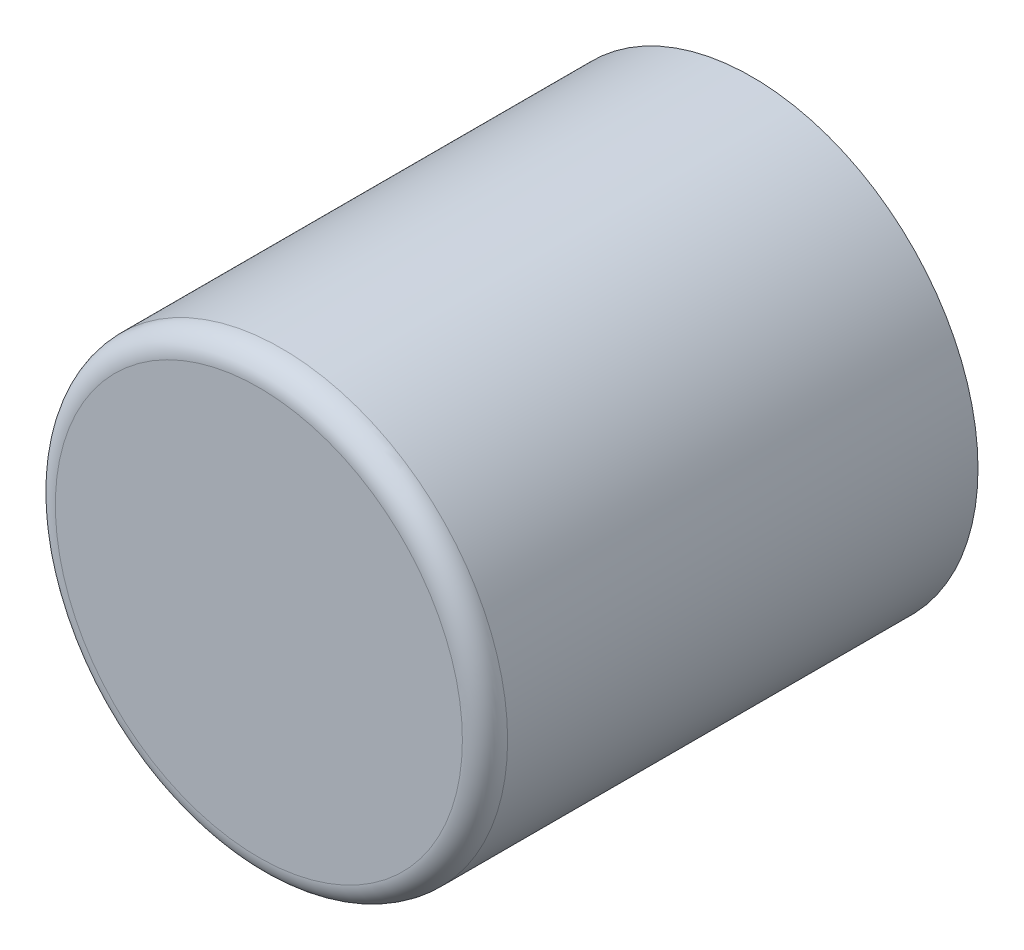
ISO-10303-21;
HEADER;
FILE_DESCRIPTION(('STEP AP214'),'2;1');
FILE_NAME('part.step','',(''),(''),'','','');
FILE_SCHEMA(('AUTOMOTIVE_DESIGN { 1 0 10303 214 1 1 1 1 }'));
ENDSEC;
DATA;
#1=APPLICATION_CONTEXT('core data for automotive mechanical design processes');
#2=APPLICATION_PROTOCOL_DEFINITION('international standard','automotive_design',2000,#1);
#3=PRODUCT_CONTEXT('',#1,'mechanical');
#4=PRODUCT('Part','Part','',(#3));
#5=PRODUCT_RELATED_PRODUCT_CATEGORY('part','',(#4));
#6=PRODUCT_DEFINITION_FORMATION('','',#4);
#7=PRODUCT_DEFINITION_CONTEXT('part definition',#1,'design');
#8=PRODUCT_DEFINITION('design','',#6,#7);
#9=PRODUCT_DEFINITION_SHAPE('','',#8);
#10=(LENGTH_UNIT() NAMED_UNIT(*) SI_UNIT(.MILLI.,.METRE.));
#11=(NAMED_UNIT(*) PLANE_ANGLE_UNIT() SI_UNIT($,.RADIAN.));
#12=(NAMED_UNIT(*) SI_UNIT($,.STERADIAN.) SOLID_ANGLE_UNIT());
#13=UNCERTAINTY_MEASURE_WITH_UNIT(LENGTH_MEASURE(1.E-05),#10,'distance_accuracy_value','');
#14=(GEOMETRIC_REPRESENTATION_CONTEXT(3) GLOBAL_UNCERTAINTY_ASSIGNED_CONTEXT((#13)) GLOBAL_UNIT_ASSIGNED_CONTEXT((#10,
#11,#12)) REPRESENTATION_CONTEXT('',''));
#15=CARTESIAN_POINT('',(0.,0.,0.));
#16=DIRECTION('',(0.,0.,1.));
#17=DIRECTION('',(1.,0.,0.));
#18=AXIS2_PLACEMENT_3D('',#15,#16,#17);
#19=CARTESIAN_POINT('',(0.,0.,150.));
#20=DIRECTION('',(0.,0.,-1.));
#21=DIRECTION('',(-1.,0.,0.));
#22=AXIS2_PLACEMENT_3D('',#19,#20,#21);
#23=CYLINDRICAL_SURFACE('',#22,100.);
#24=CARTESIAN_POINT('',(0.,0.,140.));
#25=DIRECTION('',(0.,0.,1.));
#26=DIRECTION('',(1.,0.,0.));
#27=AXIS2_PLACEMENT_3D('',#24,#25,#26);
#28=CIRCLE('',#27,100.);
#29=CARTESIAN_POINT('',(100.,0.,140.));
#30=VERTEX_POINT('',#29);
#31=EDGE_CURVE('E10',#30,#30,#28,.F.);
#32=ORIENTED_EDGE('',*,*,#31,.T.);
#33=EDGE_LOOP('',(#32));
#34=FACE_BOUND('',#33,.T.);
#35=CARTESIAN_POINT('',(0.,0.,-68.));
#36=DIRECTION('',(0.,0.,1.));
#37=DIRECTION('',(1.,0.,0.));
#38=AXIS2_PLACEMENT_3D('',#35,#36,#37);
#39=CIRCLE('',#38,100.);
#40=CARTESIAN_POINT('',(100.,0.,-68.));
#41=VERTEX_POINT('',#40);
#42=EDGE_CURVE('E55',#41,#41,#39,.T.);
#43=ORIENTED_EDGE('',*,*,#42,.T.);
#44=EDGE_LOOP('',(#43));
#45=FACE_BOUND('',#44,.T.);
#46=ADVANCED_FACE('F42',(#34,#45),#23,.T.);
#47=CARTESIAN_POINT('',(0.,0.,150.));
#48=DIRECTION('',(0.,0.,1.));
#49=DIRECTION('',(1.,0.,0.));
#50=AXIS2_PLACEMENT_3D('',#47,#48,#49);
#51=PLANE('',#50);
#52=CARTESIAN_POINT('',(0.,0.,150.));
#53=DIRECTION('',(0.,0.,1.));
#54=DIRECTION('',(1.,0.,0.));
#55=AXIS2_PLACEMENT_3D('',#52,#53,#54);
#56=CIRCLE('',#55,90.);
#57=CARTESIAN_POINT('',(90.,0.,150.));
#58=VERTEX_POINT('',#57);
#59=EDGE_CURVE('E50',#58,#58,#56,.T.);
#60=ORIENTED_EDGE('',*,*,#59,.T.);
#61=EDGE_LOOP('',(#60));
#62=FACE_BOUND('',#61,.T.);
#63=ADVANCED_FACE('F82',(#62),#51,.T.);
#64=CARTESIAN_POINT('',(0.,0.,-68.));
#65=DIRECTION('',(0.,0.,1.));
#66=DIRECTION('',(1.,0.,0.));
#67=AXIS2_PLACEMENT_3D('',#64,#65,#66);
#68=PLANE('',#67);
#69=CARTESIAN_POINT('',(0.,0.,-68.));
#70=DIRECTION('',(0.,0.,1.));
#71=DIRECTION('',(1.,0.,0.));
#72=AXIS2_PLACEMENT_3D('',#69,#70,#71);
#73=CIRCLE('',#72,90.);
#74=CARTESIAN_POINT('',(90.,0.,-68.));
#75=VERTEX_POINT('',#74);
#76=EDGE_CURVE('E60',#75,#75,#73,.F.);
#77=ORIENTED_EDGE('',*,*,#76,.F.);
#78=EDGE_LOOP('',(#77));
#79=FACE_BOUND('',#78,.T.);
#80=ORIENTED_EDGE('',*,*,#42,.F.);
#81=EDGE_LOOP('',(#80));
#82=FACE_BOUND('',#81,.T.);
#83=ADVANCED_FACE('F76',(#79,#82),#68,.F.);
#84=CARTESIAN_POINT('',(0.,0.,-88.));
#85=DIRECTION('',(0.,0.,1.));
#86=DIRECTION('',(1.,0.,0.));
#87=AXIS2_PLACEMENT_3D('',#84,#85,#86);
#88=CYLINDRICAL_SURFACE('',#87,90.);
#89=CARTESIAN_POINT('',(0.,0.,132.));
#90=DIRECTION('',(0.,0.,-1.));
#91=DIRECTION('',(-1.,0.,0.));
#92=AXIS2_PLACEMENT_3D('',#89,#90,#91);
#93=CIRCLE('',#92,90.);
#94=CARTESIAN_POINT('',(-90.,0.,132.));
#95=VERTEX_POINT('',#94);
#96=EDGE_CURVE('E65',#95,#95,#93,.T.);
#97=ORIENTED_EDGE('',*,*,#96,.F.);
#98=EDGE_LOOP('',(#97));
#99=FACE_BOUND('',#98,.T.);
#100=ORIENTED_EDGE('',*,*,#76,.T.);
#101=EDGE_LOOP('',(#100));
#102=FACE_BOUND('',#101,.T.);
#103=ADVANCED_FACE('F73',(#99,#102),#88,.F.);
#104=CARTESIAN_POINT('',(0.,0.,132.));
#105=DIRECTION('',(0.,0.,-1.));
#106=DIRECTION('',(-1.,0.,0.));
#107=AXIS2_PLACEMENT_3D('',#104,#105,#106);
#108=PLANE('',#107);
#109=ORIENTED_EDGE('',*,*,#96,.T.);
#110=EDGE_LOOP('',(#109));
#111=FACE_BOUND('',#110,.T.);
#112=ADVANCED_FACE('F71',(#111),#108,.T.);
#113=CARTESIAN_POINT('',(0.,0.,140.));
#114=DIRECTION('',(0.,0.,1.));
#115=DIRECTION('',(1.,0.,0.));
#116=AXIS2_PLACEMENT_3D('',#113,#114,#115);
#117=TOROIDAL_SURFACE('',#116,90.,10.);
#118=ORIENTED_EDGE('',*,*,#31,.F.);
#119=EDGE_LOOP('',(#118));
#120=FACE_BOUND('',#119,.T.);
#121=ORIENTED_EDGE('',*,*,#59,.F.);
#122=EDGE_LOOP('',(#121));
#123=FACE_BOUND('',#122,.T.);
#124=ADVANCED_FACE('F44',(#120,#123),#117,.T.);
#125=CLOSED_SHELL('',(#46,#63,#83,#103,#112,#124));
#126=MANIFOLD_SOLID_BREP('B2',#125);
#127=ADVANCED_BREP_SHAPE_REPRESENTATION('',(#18,#126),#14);
#128=SHAPE_DEFINITION_REPRESENTATION(#9,#127);
ENDSEC;
END-ISO-10303-21;
